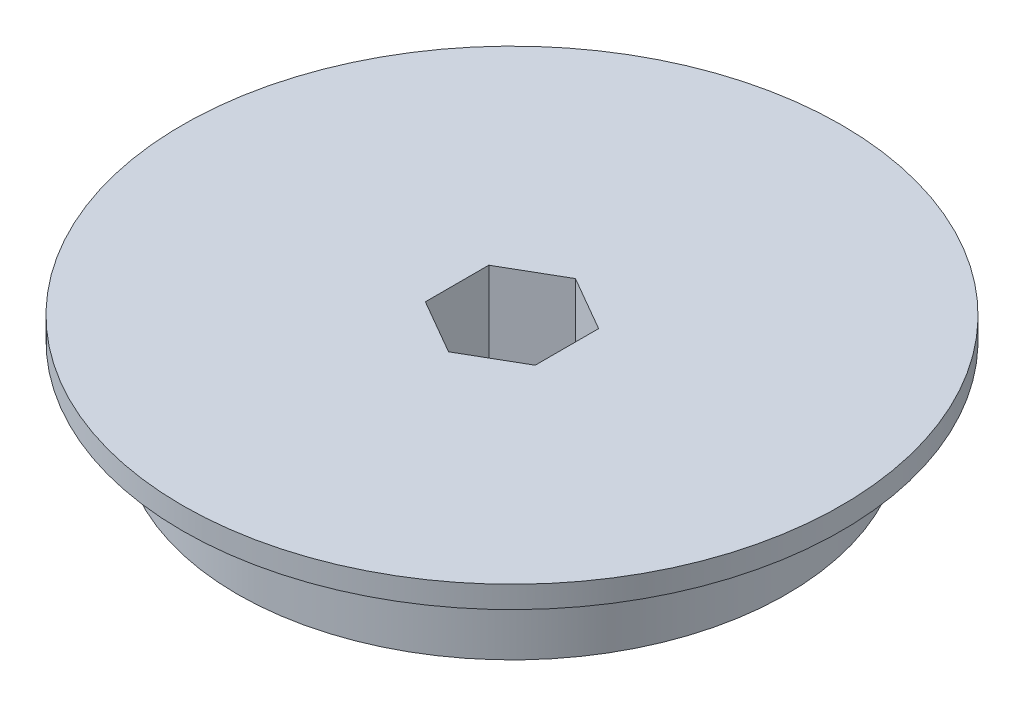
ISO-10303-21;
HEADER;
FILE_DESCRIPTION(('STEP AP214'),'2;1');
FILE_NAME('part.step','',(''),(''),'','','');
FILE_SCHEMA(('AUTOMOTIVE_DESIGN { 1 0 10303 214 1 1 1 1 }'));
ENDSEC;
DATA;
#1=APPLICATION_CONTEXT('core data for automotive mechanical design processes');
#2=APPLICATION_PROTOCOL_DEFINITION('international standard','automotive_design',2000,#1);
#3=PRODUCT_CONTEXT('',#1,'mechanical');
#4=PRODUCT('Part','Part','',(#3));
#5=PRODUCT_RELATED_PRODUCT_CATEGORY('part','',(#4));
#6=PRODUCT_DEFINITION_FORMATION('','',#4);
#7=PRODUCT_DEFINITION_CONTEXT('part definition',#1,'design');
#8=PRODUCT_DEFINITION('design','',#6,#7);
#9=PRODUCT_DEFINITION_SHAPE('','',#8);
#10=(LENGTH_UNIT() NAMED_UNIT(*) SI_UNIT(.MILLI.,.METRE.));
#11=(NAMED_UNIT(*) PLANE_ANGLE_UNIT() SI_UNIT($,.RADIAN.));
#12=(NAMED_UNIT(*) SI_UNIT($,.STERADIAN.) SOLID_ANGLE_UNIT());
#13=UNCERTAINTY_MEASURE_WITH_UNIT(LENGTH_MEASURE(1.E-05),#10,'distance_accuracy_value','');
#14=(GEOMETRIC_REPRESENTATION_CONTEXT(3) GLOBAL_UNCERTAINTY_ASSIGNED_CONTEXT((#13)) GLOBAL_UNIT_ASSIGNED_CONTEXT((#10,
#11,#12)) REPRESENTATION_CONTEXT('',''));
#15=CARTESIAN_POINT('',(0.,0.,0.));
#16=DIRECTION('',(0.,0.,1.));
#17=DIRECTION('',(1.,0.,0.));
#18=AXIS2_PLACEMENT_3D('',#15,#16,#17);
#19=CARTESIAN_POINT('',(0.,0.,0.));
#20=DIRECTION('',(0.,1.,0.));
#21=DIRECTION('',(0.,0.,1.));
#22=AXIS2_PLACEMENT_3D('',#19,#20,#21);
#23=PLANE('',#22);
#24=CARTESIAN_POINT('',(0.,0.,0.));
#25=DIRECTION('',(0.,1.,0.));
#26=DIRECTION('',(0.,0.,1.));
#27=AXIS2_PLACEMENT_3D('',#24,#25,#26);
#28=CIRCLE('',#27,10.);
#29=CARTESIAN_POINT('',(0.,0.,10.));
#30=VERTEX_POINT('',#29);
#31=EDGE_CURVE('E148',#30,#30,#28,.T.);
#32=ORIENTED_EDGE('',*,*,#31,.F.);
#33=EDGE_LOOP('',(#32));
#34=FACE_BOUND('',#33,.T.);
#35=DIRECTION('',(-0.866025403784439,0.,-0.5));
#36=VECTOR('',#35,1.);
#37=CARTESIAN_POINT('',(2.,0.,-1.15470053837925));
#38=LINE('',#37,#36);
#39=CARTESIAN_POINT('',(2.,0.,-1.15470053837925));
#40=VERTEX_POINT('',#39);
#41=CARTESIAN_POINT('',(0.,0.,-2.3094010767585));
#42=VERTEX_POINT('',#41);
#43=EDGE_CURVE('E58',#40,#42,#38,.T.);
#44=ORIENTED_EDGE('',*,*,#43,.T.);
#45=DIRECTION('',(-0.866025403784439,0.,0.5));
#46=VECTOR('',#45,1.);
#47=CARTESIAN_POINT('',(0.,0.,-2.3094010767585));
#48=LINE('',#47,#46);
#49=CARTESIAN_POINT('',(-2.,0.,-1.15470053837925));
#50=VERTEX_POINT('',#49);
#51=EDGE_CURVE('E128',#42,#50,#48,.T.);
#52=ORIENTED_EDGE('',*,*,#51,.T.);
#53=DIRECTION('',(0.,0.,1.));
#54=VECTOR('',#53,1.);
#55=CARTESIAN_POINT('',(-2.,0.,-1.15470053837925));
#56=LINE('',#55,#54);
#57=CARTESIAN_POINT('',(-2.,0.,1.15470053837925));
#58=VERTEX_POINT('',#57);
#59=EDGE_CURVE('E131',#50,#58,#56,.T.);
#60=ORIENTED_EDGE('',*,*,#59,.T.);
#61=DIRECTION('',(0.866025403784439,0.,0.5));
#62=VECTOR('',#61,1.);
#63=CARTESIAN_POINT('',(-2.,0.,1.15470053837925));
#64=LINE('',#63,#62);
#65=CARTESIAN_POINT('',(0.,0.,2.3094010767585));
#66=VERTEX_POINT('',#65);
#67=EDGE_CURVE('E134',#58,#66,#64,.T.);
#68=ORIENTED_EDGE('',*,*,#67,.T.);
#69=DIRECTION('',(0.866025403784439,0.,-0.5));
#70=VECTOR('',#69,1.);
#71=CARTESIAN_POINT('',(0.,0.,2.3094010767585));
#72=LINE('',#71,#70);
#73=CARTESIAN_POINT('',(2.,0.,1.15470053837925));
#74=VERTEX_POINT('',#73);
#75=EDGE_CURVE('E137',#66,#74,#72,.T.);
#76=ORIENTED_EDGE('',*,*,#75,.T.);
#77=DIRECTION('',(0.,0.,-1.));
#78=VECTOR('',#77,1.);
#79=CARTESIAN_POINT('',(2.,0.,1.15470053837925));
#80=LINE('',#79,#78);
#81=EDGE_CURVE('E96',#74,#40,#80,.T.);
#82=ORIENTED_EDGE('',*,*,#81,.T.);
#83=EDGE_LOOP('',(#44,#52,#60,#68,#76,#82));
#84=FACE_BOUND('',#83,.T.);
#85=ADVANCED_FACE('F35',(#34,#84),#23,.F.);
#86=CARTESIAN_POINT('',(0.,3.,0.));
#87=DIRECTION('',(0.,-1.,0.));
#88=DIRECTION('',(0.,0.,-1.));
#89=AXIS2_PLACEMENT_3D('',#86,#87,#88);
#90=CYLINDRICAL_SURFACE('',#89,10.);
#91=CARTESIAN_POINT('',(0.,2.6,0.));
#92=DIRECTION('',(0.,1.,0.));
#93=DIRECTION('',(0.,0.,1.));
#94=AXIS2_PLACEMENT_3D('',#91,#92,#93);
#95=CIRCLE('',#94,10.);
#96=CARTESIAN_POINT('',(0.,2.6,10.));
#97=VERTEX_POINT('',#96);
#98=EDGE_CURVE('E11',#97,#97,#95,.F.);
#99=ORIENTED_EDGE('',*,*,#98,.T.);
#100=EDGE_LOOP('',(#99));
#101=FACE_BOUND('',#100,.T.);
#102=ORIENTED_EDGE('',*,*,#31,.T.);
#103=EDGE_LOOP('',(#102));
#104=FACE_BOUND('',#103,.T.);
#105=ADVANCED_FACE('F165',(#101,#104),#90,.T.);
#106=CARTESIAN_POINT('',(2.,3.,-1.15470053837925));
#107=DIRECTION('',(-0.5,0.,0.866025403784438));
#108=DIRECTION('',(0.866025403784439,0.,0.5));
#109=AXIS2_PLACEMENT_3D('',#106,#107,#108);
#110=PLANE('',#109);
#111=ORIENTED_EDGE('',*,*,#43,.F.);
#112=DIRECTION('',(0.,-1.,0.));
#113=VECTOR('',#112,1.);
#114=CARTESIAN_POINT('',(2.,3.,-1.15470053837925));
#115=LINE('',#114,#113);
#116=CARTESIAN_POINT('',(2.,3.8,-1.15470053837925));
#117=VERTEX_POINT('',#116);
#118=EDGE_CURVE('E98',#117,#40,#115,.T.);
#119=ORIENTED_EDGE('',*,*,#118,.F.);
#120=DIRECTION('',(0.866025403784439,0.,0.5));
#121=VECTOR('',#120,1.);
#122=CARTESIAN_POINT('',(0.,3.8,-2.3094010767585));
#123=LINE('',#122,#121);
#124=CARTESIAN_POINT('',(0.,3.8,-2.3094010767585));
#125=VERTEX_POINT('',#124);
#126=EDGE_CURVE('E111',#125,#117,#123,.T.);
#127=ORIENTED_EDGE('',*,*,#126,.F.);
#128=DIRECTION('',(0.,-1.,0.));
#129=VECTOR('',#128,1.);
#130=CARTESIAN_POINT('',(0.,3.,-2.3094010767585));
#131=LINE('',#130,#129);
#132=EDGE_CURVE('E146',#125,#42,#131,.T.);
#133=ORIENTED_EDGE('',*,*,#132,.T.);
#134=EDGE_LOOP('',(#111,#119,#127,#133));
#135=FACE_BOUND('',#134,.T.);
#136=ADVANCED_FACE('F171',(#135),#110,.T.);
#137=CARTESIAN_POINT('',(0.,3.,-2.3094010767585));
#138=DIRECTION('',(0.5,0.,0.866025403784439));
#139=DIRECTION('',(0.866025403784439,0.,-0.5));
#140=AXIS2_PLACEMENT_3D('',#137,#138,#139);
#141=PLANE('',#140);
#142=ORIENTED_EDGE('',*,*,#51,.F.);
#143=ORIENTED_EDGE('',*,*,#132,.F.);
#144=DIRECTION('',(0.866025403784439,0.,-0.5));
#145=VECTOR('',#144,1.);
#146=CARTESIAN_POINT('',(-2.,3.8,-1.15470053837925));
#147=LINE('',#146,#145);
#148=CARTESIAN_POINT('',(-2.,3.8,-1.15470053837925));
#149=VERTEX_POINT('',#148);
#150=EDGE_CURVE('E118',#149,#125,#147,.T.);
#151=ORIENTED_EDGE('',*,*,#150,.F.);
#152=DIRECTION('',(0.,-1.,0.));
#153=VECTOR('',#152,1.);
#154=CARTESIAN_POINT('',(-2.,3.,-1.15470053837925));
#155=LINE('',#154,#153);
#156=EDGE_CURVE('E144',#149,#50,#155,.T.);
#157=ORIENTED_EDGE('',*,*,#156,.T.);
#158=EDGE_LOOP('',(#142,#143,#151,#157));
#159=FACE_BOUND('',#158,.T.);
#160=ADVANCED_FACE('F178',(#159),#141,.T.);
#161=CARTESIAN_POINT('',(-2.,3.,-1.15470053837925));
#162=DIRECTION('',(1.,0.,0.));
#163=DIRECTION('',(0.,0.,-1.));
#164=AXIS2_PLACEMENT_3D('',#161,#162,#163);
#165=PLANE('',#164);
#166=ORIENTED_EDGE('',*,*,#59,.F.);
#167=ORIENTED_EDGE('',*,*,#156,.F.);
#168=DIRECTION('',(0.,0.,-1.));
#169=VECTOR('',#168,1.);
#170=CARTESIAN_POINT('',(-2.,3.8,1.15470053837925));
#171=LINE('',#170,#169);
#172=CARTESIAN_POINT('',(-2.,3.8,1.15470053837925));
#173=VERTEX_POINT('',#172);
#174=EDGE_CURVE('E115',#173,#149,#171,.T.);
#175=ORIENTED_EDGE('',*,*,#174,.F.);
#176=DIRECTION('',(0.,-1.,0.));
#177=VECTOR('',#176,1.);
#178=CARTESIAN_POINT('',(-2.,3.,1.15470053837925));
#179=LINE('',#178,#177);
#180=EDGE_CURVE('E142',#173,#58,#179,.T.);
#181=ORIENTED_EDGE('',*,*,#180,.T.);
#182=EDGE_LOOP('',(#166,#167,#175,#181));
#183=FACE_BOUND('',#182,.T.);
#184=ADVANCED_FACE('F181',(#183),#165,.T.);
#185=CARTESIAN_POINT('',(-2.,3.,1.15470053837925));
#186=DIRECTION('',(0.5,0.,-0.866025403784438));
#187=DIRECTION('',(-0.866025403784439,0.,-0.5));
#188=AXIS2_PLACEMENT_3D('',#185,#186,#187);
#189=PLANE('',#188);
#190=ORIENTED_EDGE('',*,*,#67,.F.);
#191=ORIENTED_EDGE('',*,*,#180,.F.);
#192=DIRECTION('',(-0.866025403784439,0.,-0.5));
#193=VECTOR('',#192,1.);
#194=CARTESIAN_POINT('',(0.,3.8,2.3094010767585));
#195=LINE('',#194,#193);
#196=CARTESIAN_POINT('',(0.,3.8,2.3094010767585));
#197=VERTEX_POINT('',#196);
#198=EDGE_CURVE('E105',#197,#173,#195,.T.);
#199=ORIENTED_EDGE('',*,*,#198,.F.);
#200=DIRECTION('',(0.,-1.,0.));
#201=VECTOR('',#200,1.);
#202=CARTESIAN_POINT('',(0.,3.,2.3094010767585));
#203=LINE('',#202,#201);
#204=EDGE_CURVE('E50',#197,#66,#203,.T.);
#205=ORIENTED_EDGE('',*,*,#204,.T.);
#206=EDGE_LOOP('',(#190,#191,#199,#205));
#207=FACE_BOUND('',#206,.T.);
#208=ADVANCED_FACE('F185',(#207),#189,.T.);
#209=CARTESIAN_POINT('',(0.,3.,2.3094010767585));
#210=DIRECTION('',(-0.5,0.,-0.866025403784438));
#211=DIRECTION('',(-0.866025403784439,0.,0.5));
#212=AXIS2_PLACEMENT_3D('',#209,#210,#211);
#213=PLANE('',#212);
#214=ORIENTED_EDGE('',*,*,#75,.F.);
#215=ORIENTED_EDGE('',*,*,#204,.F.);
#216=DIRECTION('',(-0.866025403784439,0.,0.5));
#217=VECTOR('',#216,1.);
#218=CARTESIAN_POINT('',(2.,3.8,1.15470053837925));
#219=LINE('',#218,#217);
#220=CARTESIAN_POINT('',(2.,3.8,1.15470053837925));
#221=VERTEX_POINT('',#220);
#222=EDGE_CURVE('E101',#221,#197,#219,.T.);
#223=ORIENTED_EDGE('',*,*,#222,.F.);
#224=DIRECTION('',(0.,-1.,0.));
#225=VECTOR('',#224,1.);
#226=CARTESIAN_POINT('',(2.,3.,1.15470053837925));
#227=LINE('',#226,#225);
#228=EDGE_CURVE('E90',#221,#74,#227,.T.);
#229=ORIENTED_EDGE('',*,*,#228,.T.);
#230=EDGE_LOOP('',(#214,#215,#223,#229));
#231=FACE_BOUND('',#230,.T.);
#232=ADVANCED_FACE('F102',(#231),#213,.T.);
#233=CARTESIAN_POINT('',(2.,3.,1.15470053837925));
#234=DIRECTION('',(-1.,0.,0.));
#235=DIRECTION('',(0.,0.,1.));
#236=AXIS2_PLACEMENT_3D('',#233,#234,#235);
#237=PLANE('',#236);
#238=ORIENTED_EDGE('',*,*,#81,.F.);
#239=ORIENTED_EDGE('',*,*,#228,.F.);
#240=DIRECTION('',(0.,0.,1.));
#241=VECTOR('',#240,1.);
#242=CARTESIAN_POINT('',(2.,3.8,-1.15470053837925));
#243=LINE('',#242,#241);
#244=EDGE_CURVE('E93',#117,#221,#243,.T.);
#245=ORIENTED_EDGE('',*,*,#244,.F.);
#246=ORIENTED_EDGE('',*,*,#118,.T.);
#247=EDGE_LOOP('',(#238,#239,#245,#246));
#248=FACE_BOUND('',#247,.T.);
#249=ADVANCED_FACE('F91',(#248),#237,.T.);
#250=CARTESIAN_POINT('',(0.,3.,0.));
#251=DIRECTION('',(0.,1.,0.));
#252=DIRECTION('',(0.,0.,1.));
#253=AXIS2_PLACEMENT_3D('',#250,#251,#252);
#254=PLANE('',#253);
#255=CARTESIAN_POINT('',(0.,3.,0.));
#256=DIRECTION('',(0.,1.,0.));
#257=DIRECTION('',(0.,0.,1.));
#258=AXIS2_PLACEMENT_3D('',#255,#256,#257);
#259=CIRCLE('',#258,10.4);
#260=CARTESIAN_POINT('',(0.,3.,10.4));
#261=VERTEX_POINT('',#260);
#262=EDGE_CURVE('E43',#261,#261,#259,.T.);
#263=ORIENTED_EDGE('',*,*,#262,.T.);
#264=EDGE_LOOP('',(#263));
#265=FACE_BOUND('',#264,.T.);
#266=CARTESIAN_POINT('',(0.,3.,0.));
#267=DIRECTION('',(0.,1.,0.));
#268=DIRECTION('',(0.,0.,1.));
#269=AXIS2_PLACEMENT_3D('',#266,#267,#268);
#270=CIRCLE('',#269,12.);
#271=CARTESIAN_POINT('',(0.,3.,12.));
#272=VERTEX_POINT('',#271);
#273=EDGE_CURVE('E121',#272,#272,#270,.T.);
#274=ORIENTED_EDGE('',*,*,#273,.F.);
#275=EDGE_LOOP('',(#274));
#276=FACE_BOUND('',#275,.T.);
#277=ADVANCED_FACE('F153',(#265,#276),#254,.F.);
#278=CARTESIAN_POINT('',(0.,3.8,0.));
#279=DIRECTION('',(0.,-1.,0.));
#280=DIRECTION('',(0.,0.,-1.));
#281=AXIS2_PLACEMENT_3D('',#278,#279,#280);
#282=CYLINDRICAL_SURFACE('',#281,12.);
#283=CARTESIAN_POINT('',(0.,3.8,0.));
#284=DIRECTION('',(0.,1.,0.));
#285=DIRECTION('',(0.,0.,1.));
#286=AXIS2_PLACEMENT_3D('',#283,#284,#285);
#287=CIRCLE('',#286,12.);
#288=CARTESIAN_POINT('',(0.,3.8,12.));
#289=VERTEX_POINT('',#288);
#290=EDGE_CURVE('E122',#289,#289,#287,.T.);
#291=ORIENTED_EDGE('',*,*,#290,.F.);
#292=EDGE_LOOP('',(#291));
#293=FACE_BOUND('',#292,.T.);
#294=ORIENTED_EDGE('',*,*,#273,.T.);
#295=EDGE_LOOP('',(#294));
#296=FACE_BOUND('',#295,.T.);
#297=ADVANCED_FACE('F161',(#293,#296),#282,.T.);
#298=CARTESIAN_POINT('',(0.,3.8,0.));
#299=DIRECTION('',(0.,1.,0.));
#300=DIRECTION('',(0.,0.,1.));
#301=AXIS2_PLACEMENT_3D('',#298,#299,#300);
#302=PLANE('',#301);
#303=ORIENTED_EDGE('',*,*,#244,.T.);
#304=ORIENTED_EDGE('',*,*,#222,.T.);
#305=ORIENTED_EDGE('',*,*,#198,.T.);
#306=ORIENTED_EDGE('',*,*,#174,.T.);
#307=ORIENTED_EDGE('',*,*,#150,.T.);
#308=ORIENTED_EDGE('',*,*,#126,.T.);
#309=EDGE_LOOP('',(#303,#304,#305,#306,#307,#308));
#310=FACE_BOUND('',#309,.T.);
#311=ORIENTED_EDGE('',*,*,#290,.T.);
#312=EDGE_LOOP('',(#311));
#313=FACE_BOUND('',#312,.T.);
#314=ADVANCED_FACE('F107',(#310,#313),#302,.T.);
#315=CARTESIAN_POINT('',(0.,3.,0.));
#316=DIRECTION('',(0.,1.,0.));
#317=DIRECTION('',(0.,0.,1.));
#318=AXIS2_PLACEMENT_3D('',#315,#316,#317);
#319=CONICAL_SURFACE('',#318,10.4,0.785398163397453);
#320=ORIENTED_EDGE('',*,*,#98,.F.);
#321=EDGE_LOOP('',(#320));
#322=FACE_BOUND('',#321,.T.);
#323=ORIENTED_EDGE('',*,*,#262,.F.);
#324=EDGE_LOOP('',(#323));
#325=FACE_BOUND('',#324,.T.);
#326=ADVANCED_FACE('F37',(#322,#325),#319,.T.);
#327=CLOSED_SHELL('',(#85,#105,#136,#160,#184,#208,#232,#249,#277,#297,#314,#326));
#328=MANIFOLD_SOLID_BREP('B2',#327);
#329=ADVANCED_BREP_SHAPE_REPRESENTATION('',(#18,#328),#14);
#330=SHAPE_DEFINITION_REPRESENTATION(#9,#329);
ENDSEC;
END-ISO-10303-21;
